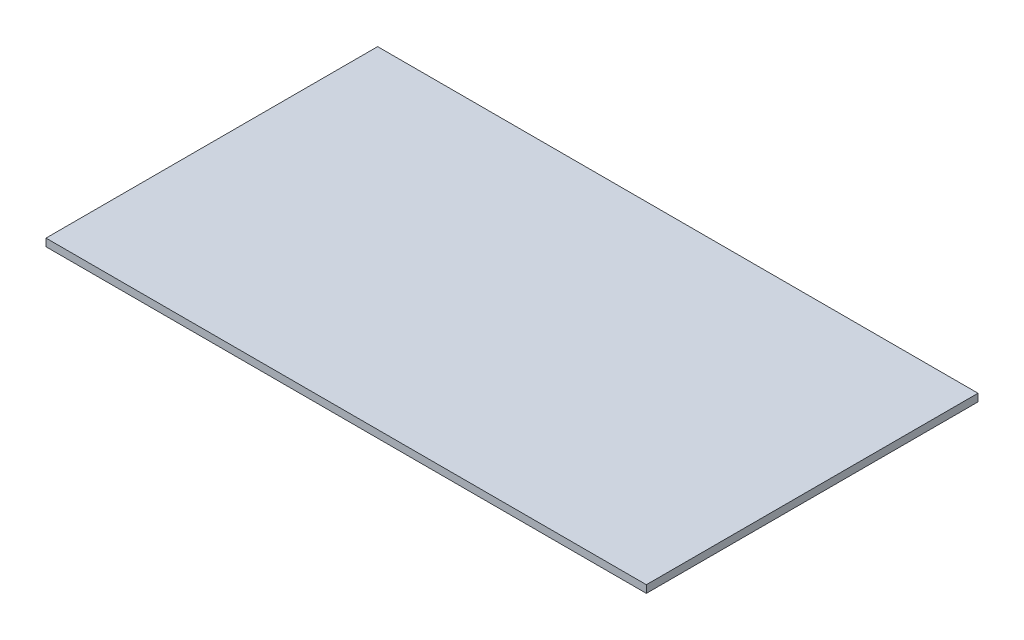
ISO-10303-21;
HEADER;
FILE_DESCRIPTION(('STEP AP214'),'2;1');
FILE_NAME('part.step','',(''),(''),'','','');
FILE_SCHEMA(('AUTOMOTIVE_DESIGN { 1 0 10303 214 1 1 1 1 }'));
ENDSEC;
DATA;
#1=APPLICATION_CONTEXT('core data for automotive mechanical design processes');
#2=APPLICATION_PROTOCOL_DEFINITION('international standard','automotive_design',2000,#1);
#3=PRODUCT_CONTEXT('',#1,'mechanical');
#4=PRODUCT('Part','Part','',(#3));
#5=PRODUCT_RELATED_PRODUCT_CATEGORY('part','',(#4));
#6=PRODUCT_DEFINITION_FORMATION('','',#4);
#7=PRODUCT_DEFINITION_CONTEXT('part definition',#1,'design');
#8=PRODUCT_DEFINITION('design','',#6,#7);
#9=PRODUCT_DEFINITION_SHAPE('','',#8);
#10=(LENGTH_UNIT() NAMED_UNIT(*) SI_UNIT(.MILLI.,.METRE.));
#11=(NAMED_UNIT(*) PLANE_ANGLE_UNIT() SI_UNIT($,.RADIAN.));
#12=(NAMED_UNIT(*) SI_UNIT($,.STERADIAN.) SOLID_ANGLE_UNIT());
#13=UNCERTAINTY_MEASURE_WITH_UNIT(LENGTH_MEASURE(1.E-05),#10,'distance_accuracy_value','');
#14=(GEOMETRIC_REPRESENTATION_CONTEXT(3) GLOBAL_UNCERTAINTY_ASSIGNED_CONTEXT((#13)) GLOBAL_UNIT_ASSIGNED_CONTEXT((#10,
#11,#12)) REPRESENTATION_CONTEXT('',''));
#15=CARTESIAN_POINT('',(0.,0.,0.));
#16=DIRECTION('',(0.,0.,1.));
#17=DIRECTION('',(1.,0.,0.));
#18=AXIS2_PLACEMENT_3D('',#15,#16,#17);
#19=CARTESIAN_POINT('',(0.,3.175,0.));
#20=DIRECTION('',(1.,0.,0.));
#21=DIRECTION('',(0.,0.,-1.));
#22=AXIS2_PLACEMENT_3D('',#19,#20,#21);
#23=PLANE('',#22);
#24=DIRECTION('',(0.,0.,1.));
#25=VECTOR('',#24,1.);
#26=CARTESIAN_POINT('',(0.,0.,0.));
#27=LINE('',#26,#25);
#28=CARTESIAN_POINT('',(0.,0.,-139.7));
#29=VERTEX_POINT('',#28);
#30=CARTESIAN_POINT('',(0.,0.,0.));
#31=VERTEX_POINT('',#30);
#32=EDGE_CURVE('E96',#29,#31,#27,.T.);
#33=ORIENTED_EDGE('',*,*,#32,.T.);
#34=DIRECTION('',(0.,-1.,0.));
#35=VECTOR('',#34,1.);
#36=CARTESIAN_POINT('',(0.,3.175,0.));
#37=LINE('',#36,#35);
#38=CARTESIAN_POINT('',(0.,3.175,0.));
#39=VERTEX_POINT('',#38);
#40=EDGE_CURVE('E11',#39,#31,#37,.T.);
#41=ORIENTED_EDGE('',*,*,#40,.F.);
#42=DIRECTION('',(0.,0.,1.));
#43=VECTOR('',#42,1.);
#44=CARTESIAN_POINT('',(0.,3.175,0.));
#45=LINE('',#44,#43);
#46=CARTESIAN_POINT('',(0.,3.175,-139.7));
#47=VERTEX_POINT('',#46);
#48=EDGE_CURVE('E84',#47,#39,#45,.T.);
#49=ORIENTED_EDGE('',*,*,#48,.F.);
#50=DIRECTION('',(0.,-1.,0.));
#51=VECTOR('',#50,1.);
#52=CARTESIAN_POINT('',(0.,3.175,-139.7));
#53=LINE('',#52,#51);
#54=EDGE_CURVE('E92',#47,#29,#53,.T.);
#55=ORIENTED_EDGE('',*,*,#54,.T.);
#56=EDGE_LOOP('',(#33,#41,#49,#55));
#57=FACE_BOUND('',#56,.T.);
#58=ADVANCED_FACE('F33',(#57),#23,.F.);
#59=CARTESIAN_POINT('',(0.,3.175,0.));
#60=DIRECTION('',(0.,0.,-1.));
#61=DIRECTION('',(-1.,0.,0.));
#62=AXIS2_PLACEMENT_3D('',#59,#60,#61);
#63=PLANE('',#62);
#64=DIRECTION('',(1.,0.,0.));
#65=VECTOR('',#64,1.);
#66=CARTESIAN_POINT('',(0.,0.,0.));
#67=LINE('',#66,#65);
#68=CARTESIAN_POINT('',(252.9,0.,0.));
#69=VERTEX_POINT('',#68);
#70=EDGE_CURVE('E88',#31,#69,#67,.T.);
#71=ORIENTED_EDGE('',*,*,#70,.T.);
#72=DIRECTION('',(0.,-1.,0.));
#73=VECTOR('',#72,1.);
#74=CARTESIAN_POINT('',(252.9,3.175,0.));
#75=LINE('',#74,#73);
#76=CARTESIAN_POINT('',(252.9,3.175,0.));
#77=VERTEX_POINT('',#76);
#78=EDGE_CURVE('E41',#77,#69,#75,.T.);
#79=ORIENTED_EDGE('',*,*,#78,.F.);
#80=DIRECTION('',(1.,0.,0.));
#81=VECTOR('',#80,1.);
#82=CARTESIAN_POINT('',(0.,3.175,0.));
#83=LINE('',#82,#81);
#84=EDGE_CURVE('E79',#39,#77,#83,.T.);
#85=ORIENTED_EDGE('',*,*,#84,.F.);
#86=ORIENTED_EDGE('',*,*,#40,.T.);
#87=EDGE_LOOP('',(#71,#79,#85,#86));
#88=FACE_BOUND('',#87,.T.);
#89=ADVANCED_FACE('F87',(#88),#63,.F.);
#90=CARTESIAN_POINT('',(252.9,3.175,0.));
#91=DIRECTION('',(-1.,0.,0.));
#92=DIRECTION('',(0.,0.,1.));
#93=AXIS2_PLACEMENT_3D('',#90,#91,#92);
#94=PLANE('',#93);
#95=DIRECTION('',(0.,0.,-1.));
#96=VECTOR('',#95,1.);
#97=CARTESIAN_POINT('',(252.9,0.,0.));
#98=LINE('',#97,#96);
#99=CARTESIAN_POINT('',(252.9,0.,-139.7));
#100=VERTEX_POINT('',#99);
#101=EDGE_CURVE('E66',#69,#100,#98,.T.);
#102=ORIENTED_EDGE('',*,*,#101,.T.);
#103=DIRECTION('',(0.,-1.,0.));
#104=VECTOR('',#103,1.);
#105=CARTESIAN_POINT('',(252.9,3.175,-139.7));
#106=LINE('',#105,#104);
#107=CARTESIAN_POINT('',(252.9,3.175,-139.7));
#108=VERTEX_POINT('',#107);
#109=EDGE_CURVE('E89',#108,#100,#106,.T.);
#110=ORIENTED_EDGE('',*,*,#109,.F.);
#111=DIRECTION('',(0.,0.,-1.));
#112=VECTOR('',#111,1.);
#113=CARTESIAN_POINT('',(252.9,3.175,0.));
#114=LINE('',#113,#112);
#115=EDGE_CURVE('E82',#77,#108,#114,.T.);
#116=ORIENTED_EDGE('',*,*,#115,.F.);
#117=ORIENTED_EDGE('',*,*,#78,.T.);
#118=EDGE_LOOP('',(#102,#110,#116,#117));
#119=FACE_BOUND('',#118,.T.);
#120=ADVANCED_FACE('F90',(#119),#94,.F.);
#121=CARTESIAN_POINT('',(0.,3.175,-139.7));
#122=DIRECTION('',(0.,0.,1.));
#123=DIRECTION('',(1.,0.,0.));
#124=AXIS2_PLACEMENT_3D('',#121,#122,#123);
#125=PLANE('',#124);
#126=DIRECTION('',(-1.,0.,0.));
#127=VECTOR('',#126,1.);
#128=CARTESIAN_POINT('',(0.,0.,-139.7));
#129=LINE('',#128,#127);
#130=EDGE_CURVE('E72',#100,#29,#129,.T.);
#131=ORIENTED_EDGE('',*,*,#130,.T.);
#132=ORIENTED_EDGE('',*,*,#54,.F.);
#133=DIRECTION('',(-1.,0.,0.));
#134=VECTOR('',#133,1.);
#135=CARTESIAN_POINT('',(0.,3.175,-139.7));
#136=LINE('',#135,#134);
#137=EDGE_CURVE('E49',#108,#47,#136,.T.);
#138=ORIENTED_EDGE('',*,*,#137,.F.);
#139=ORIENTED_EDGE('',*,*,#109,.T.);
#140=EDGE_LOOP('',(#131,#132,#138,#139));
#141=FACE_BOUND('',#140,.T.);
#142=ADVANCED_FACE('F103',(#141),#125,.F.);
#143=CARTESIAN_POINT('',(0.,3.175,0.));
#144=DIRECTION('',(0.,-1.,0.));
#145=DIRECTION('',(0.,0.,-1.));
#146=AXIS2_PLACEMENT_3D('',#143,#144,#145);
#147=PLANE('',#146);
#148=ORIENTED_EDGE('',*,*,#48,.T.);
#149=ORIENTED_EDGE('',*,*,#84,.T.);
#150=ORIENTED_EDGE('',*,*,#115,.T.);
#151=ORIENTED_EDGE('',*,*,#137,.T.);
#152=EDGE_LOOP('',(#148,#149,#150,#151));
#153=FACE_BOUND('',#152,.T.);
#154=ADVANCED_FACE('F80',(#153),#147,.F.);
#155=CARTESIAN_POINT('',(0.,0.,0.));
#156=DIRECTION('',(0.,-1.,0.));
#157=DIRECTION('',(0.,0.,-1.));
#158=AXIS2_PLACEMENT_3D('',#155,#156,#157);
#159=PLANE('',#158);
#160=ORIENTED_EDGE('',*,*,#32,.F.);
#161=ORIENTED_EDGE('',*,*,#130,.F.);
#162=ORIENTED_EDGE('',*,*,#101,.F.);
#163=ORIENTED_EDGE('',*,*,#70,.F.);
#164=EDGE_LOOP('',(#160,#161,#162,#163));
#165=FACE_BOUND('',#164,.T.);
#166=ADVANCED_FACE('F106',(#165),#159,.T.);
#167=CLOSED_SHELL('',(#58,#89,#120,#142,#154,#166));
#168=MANIFOLD_SOLID_BREP('B2',#167);
#169=ADVANCED_BREP_SHAPE_REPRESENTATION('',(#18,#168),#14);
#170=SHAPE_DEFINITION_REPRESENTATION(#9,#169);
ENDSEC;
END-ISO-10303-21;
